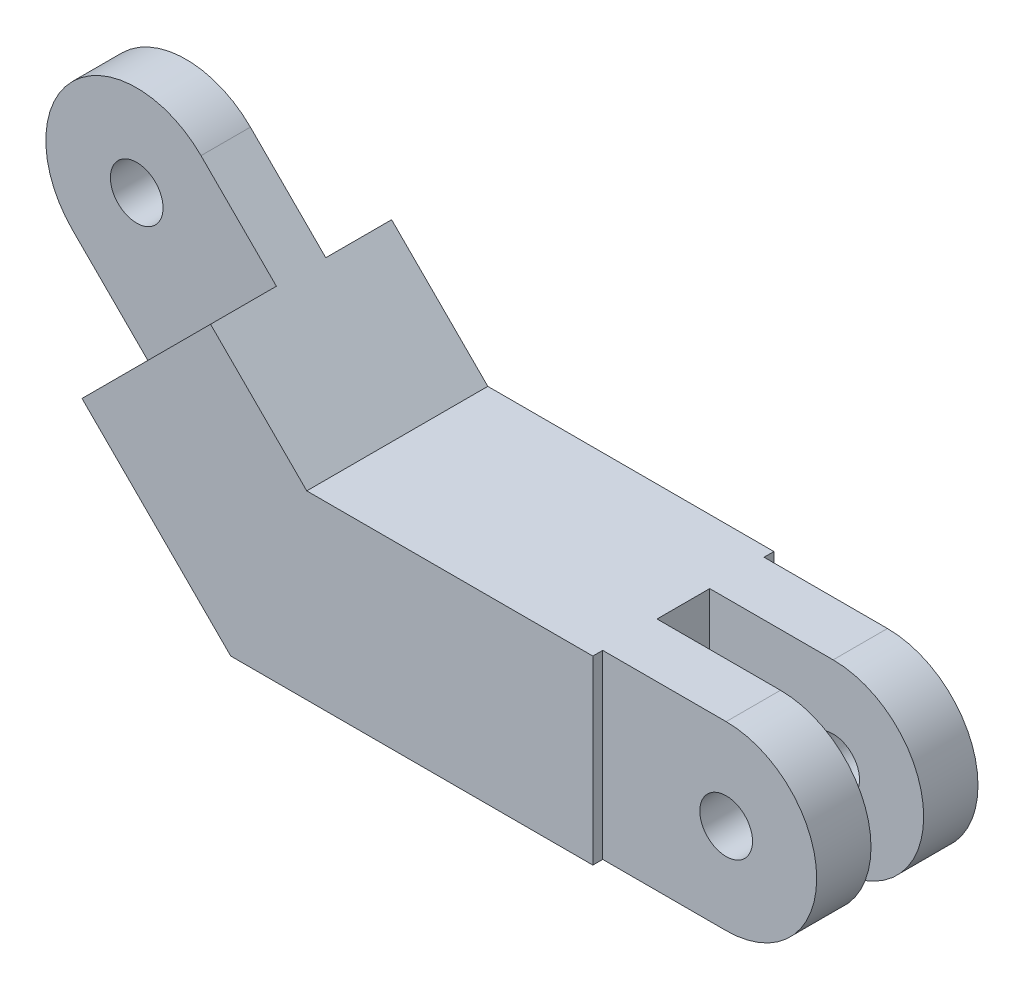
ISO-10303-21;
HEADER;
FILE_DESCRIPTION(('STEP AP214'),'2;1');
FILE_NAME('part.step','',(''),(''),'','','');
FILE_SCHEMA(('AUTOMOTIVE_DESIGN { 1 0 10303 214 1 1 1 1 }'));
ENDSEC;
DATA;
#1=APPLICATION_CONTEXT('core data for automotive mechanical design processes');
#2=APPLICATION_PROTOCOL_DEFINITION('international standard','automotive_design',2000,#1);
#3=PRODUCT_CONTEXT('',#1,'mechanical');
#4=PRODUCT('Part','Part','',(#3));
#5=PRODUCT_RELATED_PRODUCT_CATEGORY('part','',(#4));
#6=PRODUCT_DEFINITION_FORMATION('','',#4);
#7=PRODUCT_DEFINITION_CONTEXT('part definition',#1,'design');
#8=PRODUCT_DEFINITION('design','',#6,#7);
#9=PRODUCT_DEFINITION_SHAPE('','',#8);
#10=(LENGTH_UNIT() NAMED_UNIT(*) SI_UNIT(.MILLI.,.METRE.));
#11=(NAMED_UNIT(*) PLANE_ANGLE_UNIT() SI_UNIT($,.RADIAN.));
#12=(NAMED_UNIT(*) SI_UNIT($,.STERADIAN.) SOLID_ANGLE_UNIT());
#13=UNCERTAINTY_MEASURE_WITH_UNIT(LENGTH_MEASURE(1.E-05),#10,'distance_accuracy_value','');
#14=(GEOMETRIC_REPRESENTATION_CONTEXT(3) GLOBAL_UNCERTAINTY_ASSIGNED_CONTEXT((#13)) GLOBAL_UNIT_ASSIGNED_CONTEXT((#10,
#11,#12)) REPRESENTATION_CONTEXT('',''));
#15=CARTESIAN_POINT('',(0.,0.,0.));
#16=DIRECTION('',(0.,0.,1.));
#17=DIRECTION('',(1.,0.,0.));
#18=AXIS2_PLACEMENT_3D('',#15,#16,#17);
#19=CARTESIAN_POINT('',(17.5030002593994,-40.4589996337891,0.599999999999998));
#20=DIRECTION('',(0.,0.,-1.));
#21=DIRECTION('',(-1.,0.,0.));
#22=AXIS2_PLACEMENT_3D('',#19,#20,#21);
#23=CYLINDRICAL_SURFACE('',#22,5.5);
#24=DIRECTION('',(0.,0.,1.));
#25=VECTOR('',#24,1.);
#26=CARTESIAN_POINT('',(17.5030002593994,-45.9589996337891,0.599999999999998));
#27=LINE('',#26,#25);
#28=CARTESIAN_POINT('',(17.5030002593994,-45.9589996337891,0.599999999999998));
#29=VERTEX_POINT('',#28);
#30=CARTESIAN_POINT('',(17.5030002593994,-45.9589996337891,3.9));
#31=VERTEX_POINT('',#30);
#32=EDGE_CURVE('E333',#29,#31,#27,.T.);
#33=ORIENTED_EDGE('',*,*,#32,.F.);
#34=CARTESIAN_POINT('',(17.5030002593994,-40.4589996337891,0.599999999999998));
#35=DIRECTION('',(0.,0.,-1.));
#36=DIRECTION('',(-1.,0.,0.));
#37=AXIS2_PLACEMENT_3D('',#34,#35,#36);
#38=CIRCLE('',#37,5.5);
#39=CARTESIAN_POINT('',(17.5030002593994,-34.9589996337891,0.599999999999998));
#40=VERTEX_POINT('',#39);
#41=EDGE_CURVE('E50',#40,#29,#38,.T.);
#42=ORIENTED_EDGE('',*,*,#41,.F.);
#43=DIRECTION('',(0.,0.,1.));
#44=VECTOR('',#43,1.);
#45=CARTESIAN_POINT('',(17.5030002593994,-34.9589996337891,0.599999999999998));
#46=LINE('',#45,#44);
#47=CARTESIAN_POINT('',(17.5030002593994,-34.9589996337891,3.9));
#48=VERTEX_POINT('',#47);
#49=EDGE_CURVE('E336',#48,#40,#46,.F.);
#50=ORIENTED_EDGE('',*,*,#49,.F.);
#51=CARTESIAN_POINT('',(17.5030002593994,-40.4589996337891,3.9));
#52=DIRECTION('',(0.,0.,1.));
#53=DIRECTION('',(1.,0.,0.));
#54=AXIS2_PLACEMENT_3D('',#51,#52,#53);
#55=CIRCLE('',#54,5.5);
#56=EDGE_CURVE('E11',#31,#48,#55,.T.);
#57=ORIENTED_EDGE('',*,*,#56,.F.);
#58=EDGE_LOOP('',(#33,#42,#50,#57));
#59=FACE_BOUND('',#58,.T.);
#60=ADVANCED_FACE('F41',(#59),#23,.T.);
#61=CARTESIAN_POINT('',(17.5030002593994,-40.4589996337891,10.4));
#62=DIRECTION('',(0.,0.,-1.));
#63=DIRECTION('',(-1.,0.,0.));
#64=AXIS2_PLACEMENT_3D('',#61,#62,#63);
#65=CYLINDRICAL_SURFACE('',#64,5.5);
#66=DIRECTION('',(0.,0.,1.));
#67=VECTOR('',#66,1.);
#68=CARTESIAN_POINT('',(17.5030002593994,-34.9589996337891,10.4));
#69=LINE('',#68,#67);
#70=CARTESIAN_POINT('',(17.5030002593994,-34.9589996337891,10.4));
#71=VERTEX_POINT('',#70);
#72=CARTESIAN_POINT('',(17.5030002593994,-34.9589996337891,7.1));
#73=VERTEX_POINT('',#72);
#74=EDGE_CURVE('E318',#71,#73,#69,.F.);
#75=ORIENTED_EDGE('',*,*,#74,.F.);
#76=CARTESIAN_POINT('',(17.5030002593994,-40.4589996337891,10.4));
#77=DIRECTION('',(0.,0.,1.));
#78=DIRECTION('',(1.,0.,0.));
#79=AXIS2_PLACEMENT_3D('',#76,#77,#78);
#80=CIRCLE('',#79,5.5);
#81=CARTESIAN_POINT('',(17.5030002593994,-45.9589996337891,10.4));
#82=VERTEX_POINT('',#81);
#83=EDGE_CURVE('E330',#82,#71,#80,.T.);
#84=ORIENTED_EDGE('',*,*,#83,.F.);
#85=DIRECTION('',(0.,0.,1.));
#86=VECTOR('',#85,1.);
#87=CARTESIAN_POINT('',(17.5030002593994,-45.9589996337891,10.4));
#88=LINE('',#87,#86);
#89=CARTESIAN_POINT('',(17.5030002593994,-45.9589996337891,7.1));
#90=VERTEX_POINT('',#89);
#91=EDGE_CURVE('E326',#90,#82,#88,.T.);
#92=ORIENTED_EDGE('',*,*,#91,.F.);
#93=CARTESIAN_POINT('',(17.5030002593994,-40.4589996337891,7.1));
#94=DIRECTION('',(0.,0.,-1.));
#95=DIRECTION('',(-1.,0.,0.));
#96=AXIS2_PLACEMENT_3D('',#93,#94,#95);
#97=CIRCLE('',#96,5.5);
#98=EDGE_CURVE('E322',#73,#90,#97,.T.);
#99=ORIENTED_EDGE('',*,*,#98,.F.);
#100=EDGE_LOOP('',(#75,#84,#92,#99));
#101=FACE_BOUND('',#100,.T.);
#102=ADVANCED_FACE('F407',(#101),#65,.T.);
#103=CARTESIAN_POINT('',(-21.7082272396424,-28.4381843536178,4.));
#104=DIRECTION('',(0.,0.,1.));
#105=DIRECTION('',(1.,0.,0.));
#106=AXIS2_PLACEMENT_3D('',#103,#104,#105);
#107=CYLINDRICAL_SURFACE('',#106,5.52221247830828);
#108=DIRECTION('',(0.,0.,-1.));
#109=VECTOR('',#108,1.);
#110=CARTESIAN_POINT('',(-17.8034333490777,-24.533390463053,4.));
#111=LINE('',#110,#109);
#112=CARTESIAN_POINT('',(-17.8034333490777,-24.533390463053,4.));
#113=VERTEX_POINT('',#112);
#114=CARTESIAN_POINT('',(-17.8034333490777,-24.533390463053,7.));
#115=VERTEX_POINT('',#114);
#116=EDGE_CURVE('E303',#113,#115,#111,.F.);
#117=ORIENTED_EDGE('',*,*,#116,.F.);
#118=CARTESIAN_POINT('',(-21.7082272396424,-28.4381843536178,4.));
#119=DIRECTION('',(0.,0.,-1.));
#120=DIRECTION('',(-1.,0.,0.));
#121=AXIS2_PLACEMENT_3D('',#118,#119,#120);
#122=CIRCLE('',#121,5.52221247830828);
#123=CARTESIAN_POINT('',(-25.6130211302072,-32.3429782441825,4.));
#124=VERTEX_POINT('',#123);
#125=EDGE_CURVE('E312',#124,#113,#122,.T.);
#126=ORIENTED_EDGE('',*,*,#125,.F.);
#127=DIRECTION('',(0.,0.,-1.));
#128=VECTOR('',#127,1.);
#129=CARTESIAN_POINT('',(-25.6130211302071,-32.3429782441826,4.));
#130=LINE('',#129,#128);
#131=CARTESIAN_POINT('',(-25.6130211302071,-32.3429782441826,7.));
#132=VERTEX_POINT('',#131);
#133=EDGE_CURVE('E308',#132,#124,#130,.T.);
#134=ORIENTED_EDGE('',*,*,#133,.F.);
#135=CARTESIAN_POINT('',(-21.7082272396424,-28.4381843536178,7.));
#136=DIRECTION('',(0.,0.,1.));
#137=DIRECTION('',(1.,0.,0.));
#138=AXIS2_PLACEMENT_3D('',#135,#136,#137);
#139=CIRCLE('',#138,5.52221247830828);
#140=EDGE_CURVE('E315',#115,#132,#139,.T.);
#141=ORIENTED_EDGE('',*,*,#140,.F.);
#142=EDGE_LOOP('',(#117,#126,#134,#141));
#143=FACE_BOUND('',#142,.T.);
#144=ADVANCED_FACE('F411',(#143),#107,.T.);
#145=CARTESIAN_POINT('',(10.0030002593994,-34.9589996337891,11.));
#146=DIRECTION('',(-1.,0.,0.));
#147=DIRECTION('',(0.,-1.,0.));
#148=AXIS2_PLACEMENT_3D('',#145,#146,#147);
#149=PLANE('',#148);
#150=DIRECTION('',(0.,0.,-1.));
#151=VECTOR('',#150,1.);
#152=CARTESIAN_POINT('',(10.0030002593994,-45.9589996337891,11.));
#153=LINE('',#152,#151);
#154=CARTESIAN_POINT('',(10.0030002593994,-45.9589996337891,7.1));
#155=VERTEX_POINT('',#154);
#156=CARTESIAN_POINT('',(10.0030002593994,-45.9589996337891,3.9));
#157=VERTEX_POINT('',#156);
#158=EDGE_CURVE('E186',#155,#157,#153,.T.);
#159=ORIENTED_EDGE('',*,*,#158,.T.);
#160=DIRECTION('',(0.,1.,0.));
#161=VECTOR('',#160,1.);
#162=CARTESIAN_POINT('',(10.0030002593994,-45.9589996337891,3.9));
#163=LINE('',#162,#161);
#164=CARTESIAN_POINT('',(10.0030002593994,-34.9589996337891,3.9));
#165=VERTEX_POINT('',#164);
#166=EDGE_CURVE('E194',#157,#165,#163,.T.);
#167=ORIENTED_EDGE('',*,*,#166,.T.);
#168=DIRECTION('',(0.,0.,-1.));
#169=VECTOR('',#168,1.);
#170=CARTESIAN_POINT('',(10.0030002593994,-34.9589996337891,11.));
#171=LINE('',#170,#169);
#172=CARTESIAN_POINT('',(10.0030002593994,-34.9589996337891,7.1));
#173=VERTEX_POINT('',#172);
#174=EDGE_CURVE('E304',#173,#165,#171,.T.);
#175=ORIENTED_EDGE('',*,*,#174,.F.);
#176=DIRECTION('',(0.,1.,0.));
#177=VECTOR('',#176,1.);
#178=CARTESIAN_POINT('',(10.0030002593994,-45.9589996337891,7.1));
#179=LINE('',#178,#177);
#180=EDGE_CURVE('E215',#155,#173,#179,.T.);
#181=ORIENTED_EDGE('',*,*,#180,.F.);
#182=EDGE_LOOP('',(#159,#167,#175,#181));
#183=FACE_BOUND('',#182,.T.);
#184=ADVANCED_FACE('F349',(#183),#149,.F.);
#185=CARTESIAN_POINT('',(10.0030002593994,-34.9589996337891,0.599999999999998));
#186=VERTEX_POINT('',#185);
#187=CARTESIAN_POINT('',(10.0030002593994,-34.9589996337891,0.));
#188=VERTEX_POINT('',#187);
#189=EDGE_CURVE('E192',#186,#188,#171,.T.);
#190=ORIENTED_EDGE('',*,*,#189,.F.);
#191=DIRECTION('',(0.,1.,0.));
#192=VECTOR('',#191,1.);
#193=CARTESIAN_POINT('',(10.0030002593994,-45.9589996337891,0.6));
#194=LINE('',#193,#192);
#195=CARTESIAN_POINT('',(10.0030002593994,-45.9589996337891,0.6));
#196=VERTEX_POINT('',#195);
#197=EDGE_CURVE('E170',#196,#186,#194,.T.);
#198=ORIENTED_EDGE('',*,*,#197,.F.);
#199=CARTESIAN_POINT('',(10.0030002593994,-45.9589996337891,0.));
#200=VERTEX_POINT('',#199);
#201=EDGE_CURVE('E177',#196,#200,#153,.T.);
#202=ORIENTED_EDGE('',*,*,#201,.T.);
#203=DIRECTION('',(0.,1.,0.));
#204=VECTOR('',#203,1.);
#205=CARTESIAN_POINT('',(10.0030002593994,-34.9589996337891,0.));
#206=LINE('',#205,#204);
#207=EDGE_CURVE('E231',#200,#188,#206,.T.);
#208=ORIENTED_EDGE('',*,*,#207,.T.);
#209=EDGE_LOOP('',(#190,#198,#202,#208));
#210=FACE_BOUND('',#209,.T.);
#211=ADVANCED_FACE('F191',(#210),#149,.F.);
#212=CARTESIAN_POINT('',(-21.0325336465333,-36.9234657278564,11.));
#213=DIRECTION('',(0.707106781186549,-0.707106781186546,0.));
#214=DIRECTION('',(0.707106781186546,0.707106781186549,0.));
#215=AXIS2_PLACEMENT_3D('',#212,#213,#214);
#216=PLANE('',#215);
#217=DIRECTION('',(0.707106781186544,0.707106781186551,0.));
#218=VECTOR('',#217,1.);
#219=CARTESIAN_POINT('',(-29.7789614888012,-45.6698935701244,7.));
#220=LINE('',#219,#218);
#221=CARTESIAN_POINT('',(-21.0325336465333,-36.9234657278564,7.));
#222=VERTEX_POINT('',#221);
#223=CARTESIAN_POINT('',(-13.2229458654038,-29.1138779467268,7.));
#224=VERTEX_POINT('',#223);
#225=EDGE_CURVE('E238',#222,#224,#220,.T.);
#226=ORIENTED_EDGE('',*,*,#225,.F.);
#227=DIRECTION('',(0.,0.,-1.));
#228=VECTOR('',#227,1.);
#229=CARTESIAN_POINT('',(-21.0325336465333,-36.9234657278564,11.));
#230=LINE('',#229,#228);
#231=CARTESIAN_POINT('',(-21.0325336465333,-36.9234657278564,11.));
#232=VERTEX_POINT('',#231);
#233=EDGE_CURVE('E286',#232,#222,#230,.T.);
#234=ORIENTED_EDGE('',*,*,#233,.F.);
#235=DIRECTION('',(-0.707106781186546,-0.707106781186549,0.));
#236=VECTOR('',#235,1.);
#237=CARTESIAN_POINT('',(-21.0325336465333,-36.9234657278564,11.));
#238=LINE('',#237,#236);
#239=CARTESIAN_POINT('',(-13.2229458654038,-29.1138779467268,11.));
#240=VERTEX_POINT('',#239);
#241=EDGE_CURVE('E254',#240,#232,#238,.T.);
#242=ORIENTED_EDGE('',*,*,#241,.F.);
#243=DIRECTION('',(0.,0.,-1.));
#244=VECTOR('',#243,1.);
#245=CARTESIAN_POINT('',(-13.2229458654038,-29.1138779467268,11.));
#246=LINE('',#245,#244);
#247=EDGE_CURVE('E291',#240,#224,#246,.T.);
#248=ORIENTED_EDGE('',*,*,#247,.T.);
#249=EDGE_LOOP('',(#226,#234,#242,#248));
#250=FACE_BOUND('',#249,.T.);
#251=ADVANCED_FACE('F473',(#250),#216,.F.);
#252=CARTESIAN_POINT('',(10.0030002593994,-45.9589996337891,11.));
#253=VERTEX_POINT('',#252);
#254=CARTESIAN_POINT('',(10.0030002593994,-45.9589996337891,10.4));
#255=VERTEX_POINT('',#254);
#256=EDGE_CURVE('E189',#253,#255,#153,.T.);
#257=ORIENTED_EDGE('',*,*,#256,.T.);
#258=DIRECTION('',(0.,1.,0.));
#259=VECTOR('',#258,1.);
#260=CARTESIAN_POINT('',(10.0030002593994,-45.9589996337891,10.4));
#261=LINE('',#260,#259);
#262=CARTESIAN_POINT('',(10.0030002593994,-34.9589996337891,10.4));
#263=VERTEX_POINT('',#262);
#264=EDGE_CURVE('E209',#255,#263,#261,.T.);
#265=ORIENTED_EDGE('',*,*,#264,.T.);
#266=CARTESIAN_POINT('',(10.0030002593994,-34.9589996337891,11.));
#267=VERTEX_POINT('',#266);
#268=EDGE_CURVE('E299',#267,#263,#171,.T.);
#269=ORIENTED_EDGE('',*,*,#268,.F.);
#270=DIRECTION('',(0.,1.,0.));
#271=VECTOR('',#270,1.);
#272=CARTESIAN_POINT('',(10.0030002593994,-34.9589996337891,11.));
#273=LINE('',#272,#271);
#274=EDGE_CURVE('E244',#253,#267,#273,.T.);
#275=ORIENTED_EDGE('',*,*,#274,.F.);
#276=EDGE_LOOP('',(#257,#265,#269,#275));
#277=FACE_BOUND('',#276,.T.);
#278=ADVANCED_FACE('F434',(#277),#149,.F.);
#279=CARTESIAN_POINT('',(-7.37782417834154,-34.9589996337891,11.));
#280=DIRECTION('',(0.,-1.,0.));
#281=DIRECTION('',(0.,0.,-1.));
#282=AXIS2_PLACEMENT_3D('',#279,#280,#281);
#283=PLANE('',#282);
#284=DIRECTION('',(1.,0.,0.));
#285=VECTOR('',#284,1.);
#286=CARTESIAN_POINT('',(10.0030002593994,-34.9589996337891,3.9));
#287=LINE('',#286,#285);
#288=EDGE_CURVE('E355',#165,#48,#287,.T.);
#289=ORIENTED_EDGE('',*,*,#288,.T.);
#290=ORIENTED_EDGE('',*,*,#49,.T.);
#291=DIRECTION('',(-1.,0.,0.));
#292=VECTOR('',#291,1.);
#293=CARTESIAN_POINT('',(10.0030002593994,-34.9589996337891,0.6));
#294=LINE('',#293,#292);
#295=EDGE_CURVE('E357',#40,#186,#294,.T.);
#296=ORIENTED_EDGE('',*,*,#295,.T.);
#297=ORIENTED_EDGE('',*,*,#189,.T.);
#298=DIRECTION('',(-1.,0.,0.));
#299=VECTOR('',#298,1.);
#300=CARTESIAN_POINT('',(-7.37782417834154,-34.9589996337891,0.));
#301=LINE('',#300,#299);
#302=CARTESIAN_POINT('',(-7.37782417834154,-34.9589996337891,0.));
#303=VERTEX_POINT('',#302);
#304=EDGE_CURVE('E264',#188,#303,#301,.T.);
#305=ORIENTED_EDGE('',*,*,#304,.T.);
#306=DIRECTION('',(0.,0.,-1.));
#307=VECTOR('',#306,1.);
#308=CARTESIAN_POINT('',(-7.37782417834154,-34.9589996337891,11.));
#309=LINE('',#308,#307);
#310=CARTESIAN_POINT('',(-7.37782417834154,-34.9589996337891,11.));
#311=VERTEX_POINT('',#310);
#312=EDGE_CURVE('E295',#311,#303,#309,.T.);
#313=ORIENTED_EDGE('',*,*,#312,.F.);
#314=DIRECTION('',(-1.,0.,0.));
#315=VECTOR('',#314,1.);
#316=CARTESIAN_POINT('',(-7.37782417834154,-34.9589996337891,11.));
#317=LINE('',#316,#315);
#318=EDGE_CURVE('E248',#267,#311,#317,.T.);
#319=ORIENTED_EDGE('',*,*,#318,.F.);
#320=ORIENTED_EDGE('',*,*,#268,.T.);
#321=DIRECTION('',(1.,0.,0.));
#322=VECTOR('',#321,1.);
#323=CARTESIAN_POINT('',(10.0030002593994,-34.9589996337891,10.4));
#324=LINE('',#323,#322);
#325=EDGE_CURVE('E197',#263,#71,#324,.T.);
#326=ORIENTED_EDGE('',*,*,#325,.T.);
#327=ORIENTED_EDGE('',*,*,#74,.T.);
#328=DIRECTION('',(-1.,0.,0.));
#329=VECTOR('',#328,1.);
#330=CARTESIAN_POINT('',(10.0030002593994,-34.9589996337891,7.1));
#331=LINE('',#330,#329);
#332=EDGE_CURVE('E206',#73,#173,#331,.T.);
#333=ORIENTED_EDGE('',*,*,#332,.T.);
#334=ORIENTED_EDGE('',*,*,#174,.T.);
#335=EDGE_LOOP('',(#289,#290,#296,#297,#305,#313,#319,#320,#326,#327,#333,#334));
#336=FACE_BOUND('',#335,.T.);
#337=ADVANCED_FACE('F413',(#336),#283,.F.);
#338=CARTESIAN_POINT('',(-7.37782417834154,-34.9589996337891,11.));
#339=DIRECTION('',(-0.707106781186544,-0.707106781186551,0.));
#340=DIRECTION('',(0.707106781186551,-0.707106781186544,0.));
#341=AXIS2_PLACEMENT_3D('',#338,#339,#340);
#342=PLANE('',#341);
#343=DIRECTION('',(-0.707106781186551,0.707106781186544,0.));
#344=VECTOR('',#343,1.);
#345=CARTESIAN_POINT('',(-13.2229458654038,-29.1138779467268,4.));
#346=LINE('',#345,#344);
#347=CARTESIAN_POINT('',(-13.2229458654038,-29.1138779467268,4.));
#348=VERTEX_POINT('',#347);
#349=EDGE_CURVE('E234',#348,#113,#346,.T.);
#350=ORIENTED_EDGE('',*,*,#349,.T.);
#351=ORIENTED_EDGE('',*,*,#116,.T.);
#352=DIRECTION('',(0.70710678118655,-0.707106781186544,0.));
#353=VECTOR('',#352,1.);
#354=CARTESIAN_POINT('',(-13.2229458654038,-29.1138779467268,7.));
#355=LINE('',#354,#353);
#356=EDGE_CURVE('E219',#115,#224,#355,.T.);
#357=ORIENTED_EDGE('',*,*,#356,.T.);
#358=ORIENTED_EDGE('',*,*,#247,.F.);
#359=DIRECTION('',(-0.707106781186551,0.707106781186544,0.));
#360=VECTOR('',#359,1.);
#361=CARTESIAN_POINT('',(-7.37782417834154,-34.9589996337891,11.));
#362=LINE('',#361,#360);
#363=EDGE_CURVE('E251',#311,#240,#362,.T.);
#364=ORIENTED_EDGE('',*,*,#363,.F.);
#365=ORIENTED_EDGE('',*,*,#312,.T.);
#366=DIRECTION('',(-0.707106781186551,0.707106781186544,0.));
#367=VECTOR('',#366,1.);
#368=CARTESIAN_POINT('',(-7.37782417834154,-34.9589996337891,0.));
#369=LINE('',#368,#367);
#370=CARTESIAN_POINT('',(-13.2229458654038,-29.1138779467268,0.));
#371=VERTEX_POINT('',#370);
#372=EDGE_CURVE('E267',#303,#371,#369,.T.);
#373=ORIENTED_EDGE('',*,*,#372,.T.);
#374=EDGE_CURVE('E290',#348,#371,#246,.T.);
#375=ORIENTED_EDGE('',*,*,#374,.F.);
#376=EDGE_LOOP('',(#350,#351,#357,#358,#364,#365,#373,#375));
#377=FACE_BOUND('',#376,.T.);
#378=ADVANCED_FACE('F423',(#377),#342,.F.);
#379=CARTESIAN_POINT('',(-21.0325336465333,-36.9234657278564,4.));
#380=VERTEX_POINT('',#379);
#381=CARTESIAN_POINT('',(-21.0325336465333,-36.9234657278564,0.));
#382=VERTEX_POINT('',#381);
#383=EDGE_CURVE('E285',#380,#382,#230,.T.);
#384=ORIENTED_EDGE('',*,*,#383,.F.);
#385=DIRECTION('',(0.707106781186544,0.707106781186551,0.));
#386=VECTOR('',#385,1.);
#387=CARTESIAN_POINT('',(-29.7789614888012,-45.6698935701244,4.));
#388=LINE('',#387,#386);
#389=EDGE_CURVE('E227',#380,#348,#388,.T.);
#390=ORIENTED_EDGE('',*,*,#389,.T.);
#391=ORIENTED_EDGE('',*,*,#374,.T.);
#392=DIRECTION('',(-0.707106781186546,-0.707106781186549,0.));
#393=VECTOR('',#392,1.);
#394=CARTESIAN_POINT('',(-21.0325336465333,-36.9234657278564,0.));
#395=LINE('',#394,#393);
#396=EDGE_CURVE('E271',#371,#382,#395,.T.);
#397=ORIENTED_EDGE('',*,*,#396,.T.);
#398=EDGE_LOOP('',(#384,#390,#391,#397));
#399=FACE_BOUND('',#398,.T.);
#400=ADVANCED_FACE('F468',(#399),#216,.F.);
#401=CARTESIAN_POINT('',(-11.9969997406006,-45.9589996337891,11.));
#402=DIRECTION('',(0.707106781186546,0.707106781186549,0.));
#403=DIRECTION('',(-0.707106781186549,0.707106781186546,0.));
#404=AXIS2_PLACEMENT_3D('',#401,#402,#403);
#405=PLANE('',#404);
#406=DIRECTION('',(-0.707106781186549,0.707106781186546,0.));
#407=VECTOR('',#406,1.);
#408=CARTESIAN_POINT('',(-21.0325336465333,-36.9234657278564,7.));
#409=LINE('',#408,#407);
#410=EDGE_CURVE('E226',#222,#132,#409,.T.);
#411=ORIENTED_EDGE('',*,*,#410,.T.);
#412=ORIENTED_EDGE('',*,*,#133,.T.);
#413=DIRECTION('',(0.707106781186549,-0.707106781186546,0.));
#414=VECTOR('',#413,1.);
#415=CARTESIAN_POINT('',(-21.0325336465333,-36.9234657278564,4.));
#416=LINE('',#415,#414);
#417=EDGE_CURVE('E223',#124,#380,#416,.T.);
#418=ORIENTED_EDGE('',*,*,#417,.T.);
#419=ORIENTED_EDGE('',*,*,#383,.T.);
#420=DIRECTION('',(0.707106781186549,-0.707106781186546,0.));
#421=VECTOR('',#420,1.);
#422=CARTESIAN_POINT('',(-11.9969997406006,-45.9589996337891,0.));
#423=LINE('',#422,#421);
#424=CARTESIAN_POINT('',(-11.9969997406006,-45.9589996337891,0.));
#425=VERTEX_POINT('',#424);
#426=EDGE_CURVE('E275',#382,#425,#423,.T.);
#427=ORIENTED_EDGE('',*,*,#426,.T.);
#428=DIRECTION('',(0.,0.,-1.));
#429=VECTOR('',#428,1.);
#430=CARTESIAN_POINT('',(-11.9969997406006,-45.9589996337891,11.));
#431=LINE('',#430,#429);
#432=CARTESIAN_POINT('',(-11.9969997406006,-45.9589996337891,11.));
#433=VERTEX_POINT('',#432);
#434=EDGE_CURVE('E282',#433,#425,#431,.T.);
#435=ORIENTED_EDGE('',*,*,#434,.F.);
#436=DIRECTION('',(0.707106781186549,-0.707106781186546,0.));
#437=VECTOR('',#436,1.);
#438=CARTESIAN_POINT('',(-11.9969997406006,-45.9589996337891,11.));
#439=LINE('',#438,#437);
#440=EDGE_CURVE('E257',#232,#433,#439,.T.);
#441=ORIENTED_EDGE('',*,*,#440,.F.);
#442=ORIENTED_EDGE('',*,*,#233,.T.);
#443=EDGE_LOOP('',(#411,#412,#418,#419,#427,#435,#441,#442));
#444=FACE_BOUND('',#443,.T.);
#445=ADVANCED_FACE('F465',(#444),#405,.F.);
#446=CARTESIAN_POINT('',(-11.9969997406006,-45.9589996337891,11.));
#447=DIRECTION('',(0.,1.,0.));
#448=DIRECTION('',(0.,0.,1.));
#449=AXIS2_PLACEMENT_3D('',#446,#447,#448);
#450=PLANE('',#449);
#451=DIRECTION('',(-1.,0.,0.));
#452=VECTOR('',#451,1.);
#453=CARTESIAN_POINT('',(10.0030002593994,-45.9589996337891,0.6));
#454=LINE('',#453,#452);
#455=EDGE_CURVE('E165',#29,#196,#454,.T.);
#456=ORIENTED_EDGE('',*,*,#455,.F.);
#457=ORIENTED_EDGE('',*,*,#32,.T.);
#458=DIRECTION('',(1.,0.,0.));
#459=VECTOR('',#458,1.);
#460=CARTESIAN_POINT('',(10.0030002593994,-45.9589996337891,3.9));
#461=LINE('',#460,#459);
#462=EDGE_CURVE('E174',#157,#31,#461,.T.);
#463=ORIENTED_EDGE('',*,*,#462,.F.);
#464=ORIENTED_EDGE('',*,*,#158,.F.);
#465=DIRECTION('',(-1.,0.,0.));
#466=VECTOR('',#465,1.);
#467=CARTESIAN_POINT('',(10.0030002593994,-45.9589996337891,7.1));
#468=LINE('',#467,#466);
#469=EDGE_CURVE('E205',#90,#155,#468,.T.);
#470=ORIENTED_EDGE('',*,*,#469,.F.);
#471=ORIENTED_EDGE('',*,*,#91,.T.);
#472=DIRECTION('',(1.,0.,0.));
#473=VECTOR('',#472,1.);
#474=CARTESIAN_POINT('',(10.0030002593994,-45.9589996337891,10.4));
#475=LINE('',#474,#473);
#476=EDGE_CURVE('E201',#255,#82,#475,.T.);
#477=ORIENTED_EDGE('',*,*,#476,.F.);
#478=ORIENTED_EDGE('',*,*,#256,.F.);
#479=DIRECTION('',(1.,0.,0.));
#480=VECTOR('',#479,1.);
#481=CARTESIAN_POINT('',(-11.9969997406006,-45.9589996337891,11.));
#482=LINE('',#481,#480);
#483=EDGE_CURVE('E187',#433,#253,#482,.T.);
#484=ORIENTED_EDGE('',*,*,#483,.F.);
#485=ORIENTED_EDGE('',*,*,#434,.T.);
#486=DIRECTION('',(1.,0.,0.));
#487=VECTOR('',#486,1.);
#488=CARTESIAN_POINT('',(-11.9969997406006,-45.9589996337891,0.));
#489=LINE('',#488,#487);
#490=EDGE_CURVE('E181',#425,#200,#489,.T.);
#491=ORIENTED_EDGE('',*,*,#490,.T.);
#492=ORIENTED_EDGE('',*,*,#201,.F.);
#493=EDGE_LOOP('',(#456,#457,#463,#464,#470,#471,#477,#478,#484,#485,#491,#492));
#494=FACE_BOUND('',#493,.T.);
#495=ADVANCED_FACE('F178',(#494),#450,.F.);
#496=CARTESIAN_POINT('',(0.,0.,11.));
#497=DIRECTION('',(0.,0.,1.));
#498=DIRECTION('',(1.,0.,0.));
#499=AXIS2_PLACEMENT_3D('',#496,#497,#498);
#500=PLANE('',#499);
#501=ORIENTED_EDGE('',*,*,#274,.T.);
#502=ORIENTED_EDGE('',*,*,#318,.T.);
#503=ORIENTED_EDGE('',*,*,#363,.T.);
#504=ORIENTED_EDGE('',*,*,#241,.T.);
#505=ORIENTED_EDGE('',*,*,#440,.T.);
#506=ORIENTED_EDGE('',*,*,#483,.T.);
#507=EDGE_LOOP('',(#501,#502,#503,#504,#505,#506));
#508=FACE_BOUND('',#507,.T.);
#509=ADVANCED_FACE('F430',(#508),#500,.T.);
#510=CARTESIAN_POINT('',(0.,0.,0.));
#511=DIRECTION('',(0.,0.,1.));
#512=DIRECTION('',(1.,0.,0.));
#513=AXIS2_PLACEMENT_3D('',#510,#511,#512);
#514=PLANE('',#513);
#515=ORIENTED_EDGE('',*,*,#207,.F.);
#516=ORIENTED_EDGE('',*,*,#490,.F.);
#517=ORIENTED_EDGE('',*,*,#426,.F.);
#518=ORIENTED_EDGE('',*,*,#396,.F.);
#519=ORIENTED_EDGE('',*,*,#372,.F.);
#520=ORIENTED_EDGE('',*,*,#304,.F.);
#521=EDGE_LOOP('',(#515,#516,#517,#518,#519,#520));
#522=FACE_BOUND('',#521,.T.);
#523=ADVANCED_FACE('F418',(#522),#514,.F.);
#524=CARTESIAN_POINT('',(-29.7789614888012,-45.6698935701244,7.));
#525=DIRECTION('',(0.,0.,1.));
#526=DIRECTION('',(1.,0.,0.));
#527=AXIS2_PLACEMENT_3D('',#524,#525,#526);
#528=PLANE('',#527);
#529=CARTESIAN_POINT('',(-21.7082272396424,-28.4381843536178,7.));
#530=DIRECTION('',(0.,0.,1.));
#531=DIRECTION('',(1.,0.,0.));
#532=AXIS2_PLACEMENT_3D('',#529,#530,#531);
#533=CIRCLE('',#532,1.6);
#534=CARTESIAN_POINT('',(-20.1082272396424,-28.4381843536178,7.));
#535=VERTEX_POINT('',#534);
#536=EDGE_CURVE('E361',#535,#535,#533,.T.);
#537=ORIENTED_EDGE('',*,*,#536,.F.);
#538=EDGE_LOOP('',(#537));
#539=FACE_BOUND('',#538,.T.);
#540=ORIENTED_EDGE('',*,*,#356,.F.);
#541=ORIENTED_EDGE('',*,*,#140,.T.);
#542=ORIENTED_EDGE('',*,*,#410,.F.);
#543=ORIENTED_EDGE('',*,*,#225,.T.);
#544=EDGE_LOOP('',(#540,#541,#542,#543));
#545=FACE_BOUND('',#544,.T.);
#546=ADVANCED_FACE('F451',(#539,#545),#528,.T.);
#547=CARTESIAN_POINT('',(-29.7789614888012,-45.6698935701244,4.));
#548=DIRECTION('',(0.,0.,-1.));
#549=DIRECTION('',(-1.,0.,0.));
#550=AXIS2_PLACEMENT_3D('',#547,#548,#549);
#551=PLANE('',#550);
#552=CARTESIAN_POINT('',(-21.7082272396424,-28.4381843536178,4.));
#553=DIRECTION('',(0.,0.,-1.));
#554=DIRECTION('',(-1.,0.,0.));
#555=AXIS2_PLACEMENT_3D('',#552,#553,#554);
#556=CIRCLE('',#555,1.6);
#557=CARTESIAN_POINT('',(-23.3082272396424,-28.4381843536178,4.));
#558=VERTEX_POINT('',#557);
#559=EDGE_CURVE('E368',#558,#558,#556,.T.);
#560=ORIENTED_EDGE('',*,*,#559,.F.);
#561=EDGE_LOOP('',(#560));
#562=FACE_BOUND('',#561,.T.);
#563=ORIENTED_EDGE('',*,*,#417,.F.);
#564=ORIENTED_EDGE('',*,*,#125,.T.);
#565=ORIENTED_EDGE('',*,*,#349,.F.);
#566=ORIENTED_EDGE('',*,*,#389,.F.);
#567=EDGE_LOOP('',(#563,#564,#565,#566));
#568=FACE_BOUND('',#567,.T.);
#569=ADVANCED_FACE('F442',(#562,#568),#551,.T.);
#570=CARTESIAN_POINT('',(10.0030002593994,-45.9589996337891,7.1));
#571=DIRECTION('',(0.,0.,-1.));
#572=DIRECTION('',(-1.,0.,0.));
#573=AXIS2_PLACEMENT_3D('',#570,#571,#572);
#574=PLANE('',#573);
#575=CARTESIAN_POINT('',(17.5030002593994,-40.4589996337891,7.1));
#576=DIRECTION('',(0.,0.,-1.));
#577=DIRECTION('',(-1.,0.,0.));
#578=AXIS2_PLACEMENT_3D('',#575,#576,#577);
#579=CIRCLE('',#578,1.6);
#580=CARTESIAN_POINT('',(15.9030002593994,-40.4589996337891,7.1));
#581=VERTEX_POINT('',#580);
#582=EDGE_CURVE('E373',#581,#581,#579,.T.);
#583=ORIENTED_EDGE('',*,*,#582,.F.);
#584=EDGE_LOOP('',(#583));
#585=FACE_BOUND('',#584,.T.);
#586=ORIENTED_EDGE('',*,*,#332,.F.);
#587=ORIENTED_EDGE('',*,*,#98,.T.);
#588=ORIENTED_EDGE('',*,*,#469,.T.);
#589=ORIENTED_EDGE('',*,*,#180,.T.);
#590=EDGE_LOOP('',(#586,#587,#588,#589));
#591=FACE_BOUND('',#590,.T.);
#592=ADVANCED_FACE('F440',(#585,#591),#574,.T.);
#593=CARTESIAN_POINT('',(10.0030002593994,-45.9589996337891,10.4));
#594=DIRECTION('',(0.,0.,1.));
#595=DIRECTION('',(1.,0.,0.));
#596=AXIS2_PLACEMENT_3D('',#593,#594,#595);
#597=PLANE('',#596);
#598=CARTESIAN_POINT('',(17.5030002593994,-40.4589996337891,10.4));
#599=DIRECTION('',(0.,0.,1.));
#600=DIRECTION('',(1.,0.,0.));
#601=AXIS2_PLACEMENT_3D('',#598,#599,#600);
#602=CIRCLE('',#601,1.6);
#603=CARTESIAN_POINT('',(19.1030002593994,-40.4589996337891,10.4));
#604=VERTEX_POINT('',#603);
#605=EDGE_CURVE('E378',#604,#604,#602,.T.);
#606=ORIENTED_EDGE('',*,*,#605,.F.);
#607=EDGE_LOOP('',(#606));
#608=FACE_BOUND('',#607,.T.);
#609=ORIENTED_EDGE('',*,*,#476,.T.);
#610=ORIENTED_EDGE('',*,*,#83,.T.);
#611=ORIENTED_EDGE('',*,*,#325,.F.);
#612=ORIENTED_EDGE('',*,*,#264,.F.);
#613=EDGE_LOOP('',(#609,#610,#611,#612));
#614=FACE_BOUND('',#613,.T.);
#615=ADVANCED_FACE('F403',(#608,#614),#597,.T.);
#616=CARTESIAN_POINT('',(10.0030002593994,-45.9589996337891,3.9));
#617=DIRECTION('',(0.,0.,1.));
#618=DIRECTION('',(1.,0.,0.));
#619=AXIS2_PLACEMENT_3D('',#616,#617,#618);
#620=PLANE('',#619);
#621=CARTESIAN_POINT('',(17.5030002593994,-40.4589996337891,3.9));
#622=DIRECTION('',(0.,0.,1.));
#623=DIRECTION('',(1.,0.,0.));
#624=AXIS2_PLACEMENT_3D('',#621,#622,#623);
#625=CIRCLE('',#624,1.6);
#626=CARTESIAN_POINT('',(19.1030002593994,-40.4589996337891,3.9));
#627=VERTEX_POINT('',#626);
#628=EDGE_CURVE('E384',#627,#627,#625,.T.);
#629=ORIENTED_EDGE('',*,*,#628,.F.);
#630=EDGE_LOOP('',(#629));
#631=FACE_BOUND('',#630,.T.);
#632=ORIENTED_EDGE('',*,*,#462,.T.);
#633=ORIENTED_EDGE('',*,*,#56,.T.);
#634=ORIENTED_EDGE('',*,*,#288,.F.);
#635=ORIENTED_EDGE('',*,*,#166,.F.);
#636=EDGE_LOOP('',(#632,#633,#634,#635));
#637=FACE_BOUND('',#636,.T.);
#638=ADVANCED_FACE('F353',(#631,#637),#620,.T.);
#639=CARTESIAN_POINT('',(10.0030002593994,-45.9589996337891,0.6));
#640=DIRECTION('',(0.,0.,-1.));
#641=DIRECTION('',(-1.,0.,0.));
#642=AXIS2_PLACEMENT_3D('',#639,#640,#641);
#643=PLANE('',#642);
#644=CARTESIAN_POINT('',(17.5030002593994,-40.4589996337891,0.599999999999998));
#645=DIRECTION('',(0.,0.,-1.));
#646=DIRECTION('',(-1.,0.,0.));
#647=AXIS2_PLACEMENT_3D('',#644,#645,#646);
#648=CIRCLE('',#647,1.6);
#649=CARTESIAN_POINT('',(15.9030002593994,-40.4589996337891,0.599999999999998));
#650=VERTEX_POINT('',#649);
#651=EDGE_CURVE('E388',#650,#650,#648,.T.);
#652=ORIENTED_EDGE('',*,*,#651,.F.);
#653=EDGE_LOOP('',(#652));
#654=FACE_BOUND('',#653,.T.);
#655=ORIENTED_EDGE('',*,*,#295,.F.);
#656=ORIENTED_EDGE('',*,*,#41,.T.);
#657=ORIENTED_EDGE('',*,*,#455,.T.);
#658=ORIENTED_EDGE('',*,*,#197,.T.);
#659=EDGE_LOOP('',(#655,#656,#657,#658));
#660=FACE_BOUND('',#659,.T.);
#661=ADVANCED_FACE('F168',(#654,#660),#643,.T.);
#662=CARTESIAN_POINT('',(-21.7082272396424,-28.4381843536178,11.));
#663=DIRECTION('',(0.,0.,-1.));
#664=DIRECTION('',(-1.,0.,0.));
#665=AXIS2_PLACEMENT_3D('',#662,#663,#664);
#666=CYLINDRICAL_SURFACE('',#665,1.6);
#667=ORIENTED_EDGE('',*,*,#536,.T.);
#668=EDGE_LOOP('',(#667));
#669=FACE_BOUND('',#668,.T.);
#670=ORIENTED_EDGE('',*,*,#559,.T.);
#671=EDGE_LOOP('',(#670));
#672=FACE_BOUND('',#671,.T.);
#673=ADVANCED_FACE('F396',(#669,#672),#666,.F.);
#674=CARTESIAN_POINT('',(17.5030002593994,-40.4589996337891,11.));
#675=DIRECTION('',(0.,0.,-1.));
#676=DIRECTION('',(-1.,0.,0.));
#677=AXIS2_PLACEMENT_3D('',#674,#675,#676);
#678=CYLINDRICAL_SURFACE('',#677,1.6);
#679=ORIENTED_EDGE('',*,*,#628,.T.);
#680=EDGE_LOOP('',(#679));
#681=FACE_BOUND('',#680,.T.);
#682=ORIENTED_EDGE('',*,*,#651,.T.);
#683=EDGE_LOOP('',(#682));
#684=FACE_BOUND('',#683,.T.);
#685=ADVANCED_FACE('F393',(#681,#684),#678,.F.);
#686=ORIENTED_EDGE('',*,*,#582,.T.);
#687=EDGE_LOOP('',(#686));
#688=FACE_BOUND('',#687,.T.);
#689=ORIENTED_EDGE('',*,*,#605,.T.);
#690=EDGE_LOOP('',(#689));
#691=FACE_BOUND('',#690,.T.);
#692=ADVANCED_FACE('F640',(#688,#691),#678,.F.);
#693=CLOSED_SHELL('',(#60,#102,#144,#184,#211,#251,#278,#337,#378,#400,#445,#495,#509,#523,#546,
#569,#592,#615,#638,#661,#673,#685,#692));
#694=MANIFOLD_SOLID_BREP('B2',#693);
#695=ADVANCED_BREP_SHAPE_REPRESENTATION('',(#18,#694),#14);
#696=SHAPE_DEFINITION_REPRESENTATION(#9,#695);
ENDSEC;
END-ISO-10303-21;
